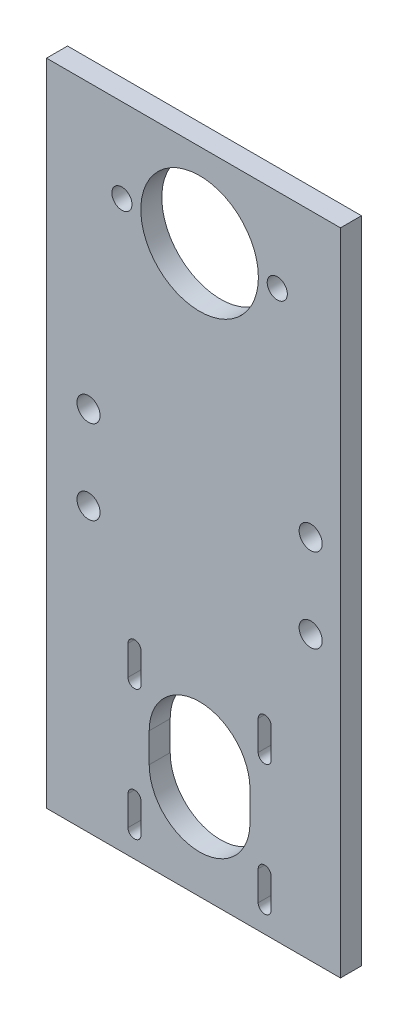
ISO-10303-21;
HEADER;
FILE_DESCRIPTION(('STEP AP214'),'2;1');
FILE_NAME('part.step','',(''),(''),'','','');
FILE_SCHEMA(('AUTOMOTIVE_DESIGN { 1 0 10303 214 1 1 1 1 }'));
ENDSEC;
DATA;
#1=APPLICATION_CONTEXT('core data for automotive mechanical design processes');
#2=APPLICATION_PROTOCOL_DEFINITION('international standard','automotive_design',2000,#1);
#3=PRODUCT_CONTEXT('',#1,'mechanical');
#4=PRODUCT('Part','Part','',(#3));
#5=PRODUCT_RELATED_PRODUCT_CATEGORY('part','',(#4));
#6=PRODUCT_DEFINITION_FORMATION('','',#4);
#7=PRODUCT_DEFINITION_CONTEXT('part definition',#1,'design');
#8=PRODUCT_DEFINITION('design','',#6,#7);
#9=PRODUCT_DEFINITION_SHAPE('','',#8);
#10=(LENGTH_UNIT() NAMED_UNIT(*) SI_UNIT(.MILLI.,.METRE.));
#11=(NAMED_UNIT(*) PLANE_ANGLE_UNIT() SI_UNIT($,.RADIAN.));
#12=(NAMED_UNIT(*) SI_UNIT($,.STERADIAN.) SOLID_ANGLE_UNIT());
#13=UNCERTAINTY_MEASURE_WITH_UNIT(LENGTH_MEASURE(1.E-05),#10,'distance_accuracy_value','');
#14=(GEOMETRIC_REPRESENTATION_CONTEXT(3) GLOBAL_UNCERTAINTY_ASSIGNED_CONTEXT((#13)) GLOBAL_UNIT_ASSIGNED_CONTEXT((#10,
#11,#12)) REPRESENTATION_CONTEXT('',''));
#15=CARTESIAN_POINT('',(0.,0.,0.));
#16=DIRECTION('',(0.,0.,1.));
#17=DIRECTION('',(1.,0.,0.));
#18=AXIS2_PLACEMENT_3D('',#15,#16,#17);
#19=CARTESIAN_POINT('',(-36.4504721681116,0.,5.));
#20=DIRECTION('',(-1.,0.,0.));
#21=DIRECTION('',(0.,0.,1.));
#22=AXIS2_PLACEMENT_3D('',#19,#20,#21);
#23=PLANE('',#22);
#24=DIRECTION('',(0.,1.,0.));
#25=VECTOR('',#24,1.);
#26=CARTESIAN_POINT('',(-36.4504721681116,0.,0.));
#27=LINE('',#26,#25);
#28=CARTESIAN_POINT('',(-36.4504721681116,-77.3565721257236,0.));
#29=VERTEX_POINT('',#28);
#30=CARTESIAN_POINT('',(-36.4504721681116,77.3565721257236,0.));
#31=VERTEX_POINT('',#30);
#32=EDGE_CURVE('E364',#29,#31,#27,.T.);
#33=ORIENTED_EDGE('',*,*,#32,.F.);
#34=DIRECTION('',(0.,0.,-1.));
#35=VECTOR('',#34,1.);
#36=CARTESIAN_POINT('',(-36.4504721681116,-77.3565721257236,5.));
#37=LINE('',#36,#35);
#38=CARTESIAN_POINT('',(-36.4504721681116,-77.3565721257236,5.));
#39=VERTEX_POINT('',#38);
#40=EDGE_CURVE('E11',#39,#29,#37,.T.);
#41=ORIENTED_EDGE('',*,*,#40,.F.);
#42=DIRECTION('',(0.,1.,0.));
#43=VECTOR('',#42,1.);
#44=CARTESIAN_POINT('',(-36.4504721681116,0.,5.));
#45=LINE('',#44,#43);
#46=CARTESIAN_POINT('',(-36.4504721681116,77.3565721257236,5.));
#47=VERTEX_POINT('',#46);
#48=EDGE_CURVE('E221',#39,#47,#45,.T.);
#49=ORIENTED_EDGE('',*,*,#48,.T.);
#50=DIRECTION('',(0.,0.,-1.));
#51=VECTOR('',#50,1.);
#52=CARTESIAN_POINT('',(-36.4504721681116,77.3565721257236,5.));
#53=LINE('',#52,#51);
#54=EDGE_CURVE('E59',#47,#31,#53,.T.);
#55=ORIENTED_EDGE('',*,*,#54,.T.);
#56=EDGE_LOOP('',(#33,#41,#49,#55));
#57=FACE_BOUND('',#56,.T.);
#58=ADVANCED_FACE('F40',(#57),#23,.T.);
#59=CARTESIAN_POINT('',(0.,-77.3565721257236,5.));
#60=DIRECTION('',(0.,1.,0.));
#61=DIRECTION('',(0.,0.,1.));
#62=AXIS2_PLACEMENT_3D('',#59,#60,#61);
#63=PLANE('',#62);
#64=DIRECTION('',(1.,0.,0.));
#65=VECTOR('',#64,1.);
#66=CARTESIAN_POINT('',(0.,-77.3565721257236,0.));
#67=LINE('',#66,#65);
#68=CARTESIAN_POINT('',(33.5495278318884,-77.3565721257236,0.));
#69=VERTEX_POINT('',#68);
#70=EDGE_CURVE('E226',#29,#69,#67,.T.);
#71=ORIENTED_EDGE('',*,*,#70,.T.);
#72=DIRECTION('',(0.,0.,-1.));
#73=VECTOR('',#72,1.);
#74=CARTESIAN_POINT('',(33.5495278318884,-77.3565721257236,5.));
#75=LINE('',#74,#73);
#76=CARTESIAN_POINT('',(33.5495278318884,-77.3565721257236,5.));
#77=VERTEX_POINT('',#76);
#78=EDGE_CURVE('E50',#77,#69,#75,.T.);
#79=ORIENTED_EDGE('',*,*,#78,.F.);
#80=DIRECTION('',(1.,0.,0.));
#81=VECTOR('',#80,1.);
#82=CARTESIAN_POINT('',(0.,-77.3565721257236,5.));
#83=LINE('',#82,#81);
#84=EDGE_CURVE('E216',#39,#77,#83,.T.);
#85=ORIENTED_EDGE('',*,*,#84,.F.);
#86=ORIENTED_EDGE('',*,*,#40,.T.);
#87=EDGE_LOOP('',(#71,#79,#85,#86));
#88=FACE_BOUND('',#87,.T.);
#89=ADVANCED_FACE('F224',(#88),#63,.F.);
#90=CARTESIAN_POINT('',(33.5495278318884,0.,5.));
#91=DIRECTION('',(-1.,0.,0.));
#92=DIRECTION('',(0.,0.,1.));
#93=AXIS2_PLACEMENT_3D('',#90,#91,#92);
#94=PLANE('',#93);
#95=DIRECTION('',(0.,1.,0.));
#96=VECTOR('',#95,1.);
#97=CARTESIAN_POINT('',(33.5495278318884,0.,0.));
#98=LINE('',#97,#96);
#99=CARTESIAN_POINT('',(33.5495278318884,77.3565721257236,0.));
#100=VERTEX_POINT('',#99);
#101=EDGE_CURVE('E367',#69,#100,#98,.T.);
#102=ORIENTED_EDGE('',*,*,#101,.T.);
#103=DIRECTION('',(0.,0.,-1.));
#104=VECTOR('',#103,1.);
#105=CARTESIAN_POINT('',(33.5495278318884,77.3565721257236,5.));
#106=LINE('',#105,#104);
#107=CARTESIAN_POINT('',(33.5495278318884,77.3565721257236,5.));
#108=VERTEX_POINT('',#107);
#109=EDGE_CURVE('E133',#108,#100,#106,.T.);
#110=ORIENTED_EDGE('',*,*,#109,.F.);
#111=DIRECTION('',(0.,1.,0.));
#112=VECTOR('',#111,1.);
#113=CARTESIAN_POINT('',(33.5495278318884,0.,5.));
#114=LINE('',#113,#112);
#115=EDGE_CURVE('E208',#77,#108,#114,.T.);
#116=ORIENTED_EDGE('',*,*,#115,.F.);
#117=ORIENTED_EDGE('',*,*,#78,.T.);
#118=EDGE_LOOP('',(#102,#110,#116,#117));
#119=FACE_BOUND('',#118,.T.);
#120=ADVANCED_FACE('F210',(#119),#94,.F.);
#121=CARTESIAN_POINT('',(-15.5,-40.6434278742764,5.));
#122=DIRECTION('',(0.,0.,-1.));
#123=DIRECTION('',(-1.,0.,0.));
#124=AXIS2_PLACEMENT_3D('',#121,#122,#123);
#125=CYLINDRICAL_SURFACE('',#124,1.55);
#126=CARTESIAN_POINT('',(-15.5,-40.6434278742764,0.));
#127=DIRECTION('',(0.,0.,1.));
#128=DIRECTION('',(1.,0.,0.));
#129=AXIS2_PLACEMENT_3D('',#126,#127,#128);
#130=CIRCLE('',#129,1.55);
#131=CARTESIAN_POINT('',(-17.05,-40.6434278742764,0.));
#132=VERTEX_POINT('',#131);
#133=CARTESIAN_POINT('',(-13.95,-40.6434278742764,0.));
#134=VERTEX_POINT('',#133);
#135=EDGE_CURVE('E331',#132,#134,#130,.T.);
#136=ORIENTED_EDGE('',*,*,#135,.F.);
#137=DIRECTION('',(0.,0.,-1.));
#138=VECTOR('',#137,1.);
#139=CARTESIAN_POINT('',(-17.05,-40.6434278742764,5.));
#140=LINE('',#139,#138);
#141=CARTESIAN_POINT('',(-17.05,-40.6434278742764,5.));
#142=VERTEX_POINT('',#141);
#143=EDGE_CURVE('E238',#142,#132,#140,.T.);
#144=ORIENTED_EDGE('',*,*,#143,.F.);
#145=CARTESIAN_POINT('',(-15.5,-40.6434278742764,5.));
#146=DIRECTION('',(0.,0.,1.));
#147=DIRECTION('',(1.,0.,0.));
#148=AXIS2_PLACEMENT_3D('',#145,#146,#147);
#149=CIRCLE('',#148,1.55);
#150=CARTESIAN_POINT('',(-13.95,-40.6434278742764,5.));
#151=VERTEX_POINT('',#150);
#152=EDGE_CURVE('E413',#142,#151,#149,.T.);
#153=ORIENTED_EDGE('',*,*,#152,.T.);
#154=DIRECTION('',(0.,0.,-1.));
#155=VECTOR('',#154,1.);
#156=CARTESIAN_POINT('',(-13.95,-40.6434278742764,5.));
#157=LINE('',#156,#155);
#158=EDGE_CURVE('E231',#151,#134,#157,.T.);
#159=ORIENTED_EDGE('',*,*,#158,.T.);
#160=EDGE_LOOP('',(#136,#144,#153,#159));
#161=FACE_BOUND('',#160,.T.);
#162=ADVANCED_FACE('F509',(#161),#125,.F.);
#163=CARTESIAN_POINT('',(-17.05,0.,5.));
#164=DIRECTION('',(1.,0.,0.));
#165=DIRECTION('',(0.,1.,0.));
#166=AXIS2_PLACEMENT_3D('',#163,#164,#165);
#167=PLANE('',#166);
#168=DIRECTION('',(0.,-1.,0.));
#169=VECTOR('',#168,1.);
#170=CARTESIAN_POINT('',(-17.05,0.,0.));
#171=LINE('',#170,#169);
#172=CARTESIAN_POINT('',(-17.05,-33.6434278742764,0.));
#173=VERTEX_POINT('',#172);
#174=EDGE_CURVE('E334',#173,#132,#171,.T.);
#175=ORIENTED_EDGE('',*,*,#174,.F.);
#176=DIRECTION('',(0.,0.,-1.));
#177=VECTOR('',#176,1.);
#178=CARTESIAN_POINT('',(-17.05,-33.6434278742764,5.));
#179=LINE('',#178,#177);
#180=CARTESIAN_POINT('',(-17.05,-33.6434278742764,5.));
#181=VERTEX_POINT('',#180);
#182=EDGE_CURVE('E236',#181,#173,#179,.T.);
#183=ORIENTED_EDGE('',*,*,#182,.F.);
#184=DIRECTION('',(0.,-1.,0.));
#185=VECTOR('',#184,1.);
#186=CARTESIAN_POINT('',(-17.05,0.,5.));
#187=LINE('',#186,#185);
#188=EDGE_CURVE('E416',#181,#142,#187,.T.);
#189=ORIENTED_EDGE('',*,*,#188,.T.);
#190=ORIENTED_EDGE('',*,*,#143,.T.);
#191=EDGE_LOOP('',(#175,#183,#189,#190));
#192=FACE_BOUND('',#191,.T.);
#193=ADVANCED_FACE('F505',(#192),#167,.T.);
#194=CARTESIAN_POINT('',(-15.5,-33.6434278742764,5.));
#195=DIRECTION('',(0.,0.,-1.));
#196=DIRECTION('',(-1.,0.,0.));
#197=AXIS2_PLACEMENT_3D('',#194,#195,#196);
#198=CYLINDRICAL_SURFACE('',#197,1.55);
#199=CARTESIAN_POINT('',(-15.5,-33.6434278742764,0.));
#200=DIRECTION('',(0.,0.,1.));
#201=DIRECTION('',(1.,0.,0.));
#202=AXIS2_PLACEMENT_3D('',#199,#200,#201);
#203=CIRCLE('',#202,1.55);
#204=CARTESIAN_POINT('',(-13.95,-33.6434278742764,0.));
#205=VERTEX_POINT('',#204);
#206=EDGE_CURVE('E337',#205,#173,#203,.T.);
#207=ORIENTED_EDGE('',*,*,#206,.F.);
#208=DIRECTION('',(0.,0.,-1.));
#209=VECTOR('',#208,1.);
#210=CARTESIAN_POINT('',(-13.95,-33.6434278742764,5.));
#211=LINE('',#210,#209);
#212=CARTESIAN_POINT('',(-13.95,-33.6434278742764,5.));
#213=VERTEX_POINT('',#212);
#214=EDGE_CURVE('E233',#213,#205,#211,.T.);
#215=ORIENTED_EDGE('',*,*,#214,.F.);
#216=CARTESIAN_POINT('',(-15.5,-33.6434278742764,5.));
#217=DIRECTION('',(0.,0.,1.));
#218=DIRECTION('',(1.,0.,0.));
#219=AXIS2_PLACEMENT_3D('',#216,#217,#218);
#220=CIRCLE('',#219,1.55);
#221=EDGE_CURVE('E419',#213,#181,#220,.T.);
#222=ORIENTED_EDGE('',*,*,#221,.T.);
#223=ORIENTED_EDGE('',*,*,#182,.T.);
#224=EDGE_LOOP('',(#207,#215,#222,#223));
#225=FACE_BOUND('',#224,.T.);
#226=ADVANCED_FACE('F501',(#225),#198,.F.);
#227=CARTESIAN_POINT('',(15.5,-40.6434278742764,5.));
#228=DIRECTION('',(0.,0.,-1.));
#229=DIRECTION('',(-1.,0.,0.));
#230=AXIS2_PLACEMENT_3D('',#227,#228,#229);
#231=CYLINDRICAL_SURFACE('',#230,1.55);
#232=CARTESIAN_POINT('',(15.5,-40.6434278742764,0.));
#233=DIRECTION('',(0.,0.,1.));
#234=DIRECTION('',(1.,0.,0.));
#235=AXIS2_PLACEMENT_3D('',#232,#233,#234);
#236=CIRCLE('',#235,1.55);
#237=CARTESIAN_POINT('',(13.95,-40.6434278742764,0.));
#238=VERTEX_POINT('',#237);
#239=CARTESIAN_POINT('',(17.05,-40.6434278742764,0.));
#240=VERTEX_POINT('',#239);
#241=EDGE_CURVE('E319',#238,#240,#236,.T.);
#242=ORIENTED_EDGE('',*,*,#241,.F.);
#243=DIRECTION('',(0.,0.,-1.));
#244=VECTOR('',#243,1.);
#245=CARTESIAN_POINT('',(13.95,-40.6434278742764,5.));
#246=LINE('',#245,#244);
#247=CARTESIAN_POINT('',(13.95,-40.6434278742764,5.));
#248=VERTEX_POINT('',#247);
#249=EDGE_CURVE('E234',#248,#238,#246,.T.);
#250=ORIENTED_EDGE('',*,*,#249,.F.);
#251=CARTESIAN_POINT('',(15.5,-40.6434278742764,5.));
#252=DIRECTION('',(0.,0.,1.));
#253=DIRECTION('',(1.,0.,0.));
#254=AXIS2_PLACEMENT_3D('',#251,#252,#253);
#255=CIRCLE('',#254,1.55);
#256=CARTESIAN_POINT('',(17.05,-40.6434278742764,5.));
#257=VERTEX_POINT('',#256);
#258=EDGE_CURVE('E402',#248,#257,#255,.T.);
#259=ORIENTED_EDGE('',*,*,#258,.T.);
#260=DIRECTION('',(0.,0.,-1.));
#261=VECTOR('',#260,1.);
#262=CARTESIAN_POINT('',(17.05,-40.6434278742764,5.));
#263=LINE('',#262,#261);
#264=EDGE_CURVE('E240',#257,#240,#263,.T.);
#265=ORIENTED_EDGE('',*,*,#264,.T.);
#266=EDGE_LOOP('',(#242,#250,#259,#265));
#267=FACE_BOUND('',#266,.T.);
#268=ADVANCED_FACE('F504',(#267),#231,.F.);
#269=CARTESIAN_POINT('',(13.95,0.,5.));
#270=DIRECTION('',(1.,0.,0.));
#271=DIRECTION('',(0.,0.,-1.));
#272=AXIS2_PLACEMENT_3D('',#269,#270,#271);
#273=PLANE('',#272);
#274=DIRECTION('',(0.,-1.,0.));
#275=VECTOR('',#274,1.);
#276=CARTESIAN_POINT('',(13.95,0.,0.));
#277=LINE('',#276,#275);
#278=CARTESIAN_POINT('',(13.95,-33.6434278742764,0.));
#279=VERTEX_POINT('',#278);
#280=EDGE_CURVE('E322',#279,#238,#277,.T.);
#281=ORIENTED_EDGE('',*,*,#280,.F.);
#282=DIRECTION('',(0.,0.,-1.));
#283=VECTOR('',#282,1.);
#284=CARTESIAN_POINT('',(13.95,-33.6434278742764,5.));
#285=LINE('',#284,#283);
#286=CARTESIAN_POINT('',(13.95,-33.6434278742764,5.));
#287=VERTEX_POINT('',#286);
#288=EDGE_CURVE('E245',#287,#279,#285,.T.);
#289=ORIENTED_EDGE('',*,*,#288,.F.);
#290=DIRECTION('',(0.,-1.,0.));
#291=VECTOR('',#290,1.);
#292=CARTESIAN_POINT('',(13.95,0.,5.));
#293=LINE('',#292,#291);
#294=EDGE_CURVE('E405',#287,#248,#293,.T.);
#295=ORIENTED_EDGE('',*,*,#294,.T.);
#296=ORIENTED_EDGE('',*,*,#249,.T.);
#297=EDGE_LOOP('',(#281,#289,#295,#296));
#298=FACE_BOUND('',#297,.T.);
#299=ADVANCED_FACE('F522',(#298),#273,.T.);
#300=CARTESIAN_POINT('',(15.5,-33.6434278742764,5.));
#301=DIRECTION('',(0.,0.,-1.));
#302=DIRECTION('',(-1.,0.,0.));
#303=AXIS2_PLACEMENT_3D('',#300,#301,#302);
#304=CYLINDRICAL_SURFACE('',#303,1.55);
#305=CARTESIAN_POINT('',(15.5,-33.6434278742764,0.));
#306=DIRECTION('',(0.,0.,1.));
#307=DIRECTION('',(1.,0.,0.));
#308=AXIS2_PLACEMENT_3D('',#305,#306,#307);
#309=CIRCLE('',#308,1.55);
#310=CARTESIAN_POINT('',(17.05,-33.6434278742764,0.));
#311=VERTEX_POINT('',#310);
#312=EDGE_CURVE('E325',#311,#279,#309,.T.);
#313=ORIENTED_EDGE('',*,*,#312,.F.);
#314=DIRECTION('',(0.,0.,-1.));
#315=VECTOR('',#314,1.);
#316=CARTESIAN_POINT('',(17.05,-33.6434278742764,5.));
#317=LINE('',#316,#315);
#318=CARTESIAN_POINT('',(17.05,-33.6434278742764,5.));
#319=VERTEX_POINT('',#318);
#320=EDGE_CURVE('E242',#319,#311,#317,.T.);
#321=ORIENTED_EDGE('',*,*,#320,.F.);
#322=CARTESIAN_POINT('',(15.5,-33.6434278742764,5.));
#323=DIRECTION('',(0.,0.,1.));
#324=DIRECTION('',(1.,0.,0.));
#325=AXIS2_PLACEMENT_3D('',#322,#323,#324);
#326=CIRCLE('',#325,1.55);
#327=EDGE_CURVE('E408',#319,#287,#326,.T.);
#328=ORIENTED_EDGE('',*,*,#327,.T.);
#329=ORIENTED_EDGE('',*,*,#288,.T.);
#330=EDGE_LOOP('',(#313,#321,#328,#329));
#331=FACE_BOUND('',#330,.T.);
#332=ADVANCED_FACE('F518',(#331),#304,.F.);
#333=CARTESIAN_POINT('',(15.5,-71.6434278742764,5.));
#334=DIRECTION('',(0.,0.,-1.));
#335=DIRECTION('',(-1.,0.,0.));
#336=AXIS2_PLACEMENT_3D('',#333,#334,#335);
#337=CYLINDRICAL_SURFACE('',#336,1.55);
#338=CARTESIAN_POINT('',(15.5,-71.6434278742764,0.));
#339=DIRECTION('',(0.,0.,1.));
#340=DIRECTION('',(1.,0.,0.));
#341=AXIS2_PLACEMENT_3D('',#338,#339,#340);
#342=CIRCLE('',#341,1.55);
#343=CARTESIAN_POINT('',(13.95,-71.6434278742764,0.));
#344=VERTEX_POINT('',#343);
#345=CARTESIAN_POINT('',(17.05,-71.6434278742764,0.));
#346=VERTEX_POINT('',#345);
#347=EDGE_CURVE('E307',#344,#346,#342,.T.);
#348=ORIENTED_EDGE('',*,*,#347,.F.);
#349=DIRECTION('',(0.,0.,-1.));
#350=VECTOR('',#349,1.);
#351=CARTESIAN_POINT('',(13.95,-71.6434278742764,5.));
#352=LINE('',#351,#350);
#353=CARTESIAN_POINT('',(13.95,-71.6434278742764,5.));
#354=VERTEX_POINT('',#353);
#355=EDGE_CURVE('E243',#354,#344,#352,.T.);
#356=ORIENTED_EDGE('',*,*,#355,.F.);
#357=CARTESIAN_POINT('',(15.5,-71.6434278742764,5.));
#358=DIRECTION('',(0.,0.,1.));
#359=DIRECTION('',(1.,0.,0.));
#360=AXIS2_PLACEMENT_3D('',#357,#358,#359);
#361=CIRCLE('',#360,1.55);
#362=CARTESIAN_POINT('',(17.05,-71.6434278742764,5.));
#363=VERTEX_POINT('',#362);
#364=EDGE_CURVE('E391',#354,#363,#361,.T.);
#365=ORIENTED_EDGE('',*,*,#364,.T.);
#366=DIRECTION('',(0.,0.,-1.));
#367=VECTOR('',#366,1.);
#368=CARTESIAN_POINT('',(17.05,-71.6434278742764,5.));
#369=LINE('',#368,#367);
#370=EDGE_CURVE('E248',#363,#346,#369,.T.);
#371=ORIENTED_EDGE('',*,*,#370,.T.);
#372=EDGE_LOOP('',(#348,#356,#365,#371));
#373=FACE_BOUND('',#372,.T.);
#374=ADVANCED_FACE('F521',(#373),#337,.F.);
#375=CARTESIAN_POINT('',(13.95,0.,5.));
#376=DIRECTION('',(1.,0.,0.));
#377=DIRECTION('',(0.,0.,-1.));
#378=AXIS2_PLACEMENT_3D('',#375,#376,#377);
#379=PLANE('',#378);
#380=DIRECTION('',(0.,-1.,0.));
#381=VECTOR('',#380,1.);
#382=CARTESIAN_POINT('',(13.95,0.,0.));
#383=LINE('',#382,#381);
#384=CARTESIAN_POINT('',(13.95,-64.6434278742764,0.));
#385=VERTEX_POINT('',#384);
#386=EDGE_CURVE('E310',#385,#344,#383,.T.);
#387=ORIENTED_EDGE('',*,*,#386,.F.);
#388=DIRECTION('',(0.,0.,-1.));
#389=VECTOR('',#388,1.);
#390=CARTESIAN_POINT('',(13.95,-64.6434278742764,5.));
#391=LINE('',#390,#389);
#392=CARTESIAN_POINT('',(13.95,-64.6434278742764,5.));
#393=VERTEX_POINT('',#392);
#394=EDGE_CURVE('E253',#393,#385,#391,.T.);
#395=ORIENTED_EDGE('',*,*,#394,.F.);
#396=DIRECTION('',(0.,-1.,0.));
#397=VECTOR('',#396,1.);
#398=CARTESIAN_POINT('',(13.95,0.,5.));
#399=LINE('',#398,#397);
#400=EDGE_CURVE('E394',#393,#354,#399,.T.);
#401=ORIENTED_EDGE('',*,*,#400,.T.);
#402=ORIENTED_EDGE('',*,*,#355,.T.);
#403=EDGE_LOOP('',(#387,#395,#401,#402));
#404=FACE_BOUND('',#403,.T.);
#405=ADVANCED_FACE('F537',(#404),#379,.T.);
#406=CARTESIAN_POINT('',(15.5,-64.6434278742764,5.));
#407=DIRECTION('',(0.,0.,-1.));
#408=DIRECTION('',(-1.,0.,0.));
#409=AXIS2_PLACEMENT_3D('',#406,#407,#408);
#410=CYLINDRICAL_SURFACE('',#409,1.55);
#411=CARTESIAN_POINT('',(15.5,-64.6434278742764,0.));
#412=DIRECTION('',(0.,0.,1.));
#413=DIRECTION('',(1.,0.,0.));
#414=AXIS2_PLACEMENT_3D('',#411,#412,#413);
#415=CIRCLE('',#414,1.55);
#416=CARTESIAN_POINT('',(17.05,-64.6434278742764,0.));
#417=VERTEX_POINT('',#416);
#418=EDGE_CURVE('E313',#417,#385,#415,.T.);
#419=ORIENTED_EDGE('',*,*,#418,.F.);
#420=DIRECTION('',(0.,0.,-1.));
#421=VECTOR('',#420,1.);
#422=CARTESIAN_POINT('',(17.05,-64.6434278742764,5.));
#423=LINE('',#422,#421);
#424=CARTESIAN_POINT('',(17.05,-64.6434278742764,5.));
#425=VERTEX_POINT('',#424);
#426=EDGE_CURVE('E250',#425,#417,#423,.T.);
#427=ORIENTED_EDGE('',*,*,#426,.F.);
#428=CARTESIAN_POINT('',(15.5,-64.6434278742764,5.));
#429=DIRECTION('',(0.,0.,1.));
#430=DIRECTION('',(1.,0.,0.));
#431=AXIS2_PLACEMENT_3D('',#428,#429,#430);
#432=CIRCLE('',#431,1.55);
#433=EDGE_CURVE('E397',#425,#393,#432,.T.);
#434=ORIENTED_EDGE('',*,*,#433,.T.);
#435=ORIENTED_EDGE('',*,*,#394,.T.);
#436=EDGE_LOOP('',(#419,#427,#434,#435));
#437=FACE_BOUND('',#436,.T.);
#438=ADVANCED_FACE('F533',(#437),#410,.F.);
#439=CARTESIAN_POINT('',(-15.5,-71.6434278742764,5.));
#440=DIRECTION('',(0.,0.,-1.));
#441=DIRECTION('',(-1.,0.,0.));
#442=AXIS2_PLACEMENT_3D('',#439,#440,#441);
#443=CYLINDRICAL_SURFACE('',#442,1.55);
#444=CARTESIAN_POINT('',(-15.5,-71.6434278742764,0.));
#445=DIRECTION('',(0.,0.,1.));
#446=DIRECTION('',(1.,0.,0.));
#447=AXIS2_PLACEMENT_3D('',#444,#445,#446);
#448=CIRCLE('',#447,1.55);
#449=CARTESIAN_POINT('',(-17.05,-71.6434278742764,0.));
#450=VERTEX_POINT('',#449);
#451=CARTESIAN_POINT('',(-13.95,-71.6434278742764,0.));
#452=VERTEX_POINT('',#451);
#453=EDGE_CURVE('E295',#450,#452,#448,.T.);
#454=ORIENTED_EDGE('',*,*,#453,.F.);
#455=DIRECTION('',(0.,0.,-1.));
#456=VECTOR('',#455,1.);
#457=CARTESIAN_POINT('',(-17.05,-71.6434278742764,5.));
#458=LINE('',#457,#456);
#459=CARTESIAN_POINT('',(-17.05,-71.6434278742764,5.));
#460=VERTEX_POINT('',#459);
#461=EDGE_CURVE('E251',#460,#450,#458,.T.);
#462=ORIENTED_EDGE('',*,*,#461,.F.);
#463=CARTESIAN_POINT('',(-15.5,-71.6434278742764,5.));
#464=DIRECTION('',(0.,0.,1.));
#465=DIRECTION('',(1.,0.,0.));
#466=AXIS2_PLACEMENT_3D('',#463,#464,#465);
#467=CIRCLE('',#466,1.55);
#468=CARTESIAN_POINT('',(-13.95,-71.6434278742764,5.));
#469=VERTEX_POINT('',#468);
#470=EDGE_CURVE('E380',#460,#469,#467,.T.);
#471=ORIENTED_EDGE('',*,*,#470,.T.);
#472=DIRECTION('',(0.,0.,-1.));
#473=VECTOR('',#472,1.);
#474=CARTESIAN_POINT('',(-13.95,-71.6434278742764,5.));
#475=LINE('',#474,#473);
#476=EDGE_CURVE('E256',#469,#452,#475,.T.);
#477=ORIENTED_EDGE('',*,*,#476,.T.);
#478=EDGE_LOOP('',(#454,#462,#471,#477));
#479=FACE_BOUND('',#478,.T.);
#480=ADVANCED_FACE('F536',(#479),#443,.F.);
#481=CARTESIAN_POINT('',(-17.05,0.,5.));
#482=DIRECTION('',(1.,0.,0.));
#483=DIRECTION('',(0.,0.,-1.));
#484=AXIS2_PLACEMENT_3D('',#481,#482,#483);
#485=PLANE('',#484);
#486=DIRECTION('',(0.,-1.,0.));
#487=VECTOR('',#486,1.);
#488=CARTESIAN_POINT('',(-17.05,0.,0.));
#489=LINE('',#488,#487);
#490=CARTESIAN_POINT('',(-17.05,-64.6434278742764,0.));
#491=VERTEX_POINT('',#490);
#492=EDGE_CURVE('E298',#491,#450,#489,.T.);
#493=ORIENTED_EDGE('',*,*,#492,.F.);
#494=DIRECTION('',(0.,0.,-1.));
#495=VECTOR('',#494,1.);
#496=CARTESIAN_POINT('',(-17.05,-64.6434278742764,5.));
#497=LINE('',#496,#495);
#498=CARTESIAN_POINT('',(-17.05,-64.6434278742764,5.));
#499=VERTEX_POINT('',#498);
#500=EDGE_CURVE('E260',#499,#491,#497,.T.);
#501=ORIENTED_EDGE('',*,*,#500,.F.);
#502=DIRECTION('',(0.,-1.,0.));
#503=VECTOR('',#502,1.);
#504=CARTESIAN_POINT('',(-17.05,0.,5.));
#505=LINE('',#504,#503);
#506=EDGE_CURVE('E383',#499,#460,#505,.T.);
#507=ORIENTED_EDGE('',*,*,#506,.T.);
#508=ORIENTED_EDGE('',*,*,#461,.T.);
#509=EDGE_LOOP('',(#493,#501,#507,#508));
#510=FACE_BOUND('',#509,.T.);
#511=ADVANCED_FACE('F551',(#510),#485,.T.);
#512=CARTESIAN_POINT('',(-15.5,-64.6434278742764,5.));
#513=DIRECTION('',(0.,0.,-1.));
#514=DIRECTION('',(-1.,0.,0.));
#515=AXIS2_PLACEMENT_3D('',#512,#513,#514);
#516=CYLINDRICAL_SURFACE('',#515,1.55);
#517=CARTESIAN_POINT('',(-15.5,-64.6434278742764,0.));
#518=DIRECTION('',(0.,0.,1.));
#519=DIRECTION('',(1.,0.,0.));
#520=AXIS2_PLACEMENT_3D('',#517,#518,#519);
#521=CIRCLE('',#520,1.55);
#522=CARTESIAN_POINT('',(-13.95,-64.6434278742764,0.));
#523=VERTEX_POINT('',#522);
#524=EDGE_CURVE('E301',#523,#491,#521,.T.);
#525=ORIENTED_EDGE('',*,*,#524,.F.);
#526=DIRECTION('',(0.,0.,-1.));
#527=VECTOR('',#526,1.);
#528=CARTESIAN_POINT('',(-13.95,-64.6434278742764,5.));
#529=LINE('',#528,#527);
#530=CARTESIAN_POINT('',(-13.95,-64.6434278742764,5.));
#531=VERTEX_POINT('',#530);
#532=EDGE_CURVE('E258',#531,#523,#529,.T.);
#533=ORIENTED_EDGE('',*,*,#532,.F.);
#534=CARTESIAN_POINT('',(-15.5,-64.6434278742764,5.));
#535=DIRECTION('',(0.,0.,1.));
#536=DIRECTION('',(1.,0.,0.));
#537=AXIS2_PLACEMENT_3D('',#534,#535,#536);
#538=CIRCLE('',#537,1.55);
#539=EDGE_CURVE('E386',#531,#499,#538,.T.);
#540=ORIENTED_EDGE('',*,*,#539,.T.);
#541=ORIENTED_EDGE('',*,*,#500,.T.);
#542=EDGE_LOOP('',(#525,#533,#540,#541));
#543=FACE_BOUND('',#542,.T.);
#544=ADVANCED_FACE('F548',(#543),#516,.F.);
#545=CARTESIAN_POINT('',(0.,-49.1434278742764,5.));
#546=DIRECTION('',(0.,0.,-1.));
#547=DIRECTION('',(-1.,0.,0.));
#548=AXIS2_PLACEMENT_3D('',#545,#546,#547);
#549=CYLINDRICAL_SURFACE('',#548,12.);
#550=CARTESIAN_POINT('',(0.,-49.1434278742764,0.));
#551=DIRECTION('',(0.,0.,1.));
#552=DIRECTION('',(1.,0.,0.));
#553=AXIS2_PLACEMENT_3D('',#550,#551,#552);
#554=CIRCLE('',#553,12.);
#555=CARTESIAN_POINT('',(12.,-49.1434278742764,0.));
#556=VERTEX_POINT('',#555);
#557=CARTESIAN_POINT('',(-12.,-49.1434278742764,0.));
#558=VERTEX_POINT('',#557);
#559=EDGE_CURVE('E280',#556,#558,#554,.T.);
#560=ORIENTED_EDGE('',*,*,#559,.F.);
#561=DIRECTION('',(0.,0.,-1.));
#562=VECTOR('',#561,1.);
#563=CARTESIAN_POINT('',(12.,-49.1434278742764,5.));
#564=LINE('',#563,#562);
#565=CARTESIAN_POINT('',(12.,-49.1434278742764,5.));
#566=VERTEX_POINT('',#565);
#567=EDGE_CURVE('E44',#566,#556,#564,.T.);
#568=ORIENTED_EDGE('',*,*,#567,.F.);
#569=CARTESIAN_POINT('',(0.,-49.1434278742764,5.));
#570=DIRECTION('',(0.,0.,1.));
#571=DIRECTION('',(1.,0.,0.));
#572=AXIS2_PLACEMENT_3D('',#569,#570,#571);
#573=CIRCLE('',#572,12.);
#574=CARTESIAN_POINT('',(-12.,-49.1434278742764,5.));
#575=VERTEX_POINT('',#574);
#576=EDGE_CURVE('E371',#566,#575,#573,.T.);
#577=ORIENTED_EDGE('',*,*,#576,.T.);
#578=DIRECTION('',(0.,0.,-1.));
#579=VECTOR('',#578,1.);
#580=CARTESIAN_POINT('',(-12.,-49.1434278742764,5.));
#581=LINE('',#580,#579);
#582=EDGE_CURVE('E263',#575,#558,#581,.T.);
#583=ORIENTED_EDGE('',*,*,#582,.T.);
#584=EDGE_LOOP('',(#560,#568,#577,#583));
#585=FACE_BOUND('',#584,.T.);
#586=ADVANCED_FACE('F42',(#585),#549,.F.);
#587=CARTESIAN_POINT('',(12.,0.,5.));
#588=DIRECTION('',(-1.,0.,0.));
#589=DIRECTION('',(0.,-1.,0.));
#590=AXIS2_PLACEMENT_3D('',#587,#588,#589);
#591=PLANE('',#590);
#592=DIRECTION('',(0.,1.,0.));
#593=VECTOR('',#592,1.);
#594=CARTESIAN_POINT('',(12.,0.,0.));
#595=LINE('',#594,#593);
#596=CARTESIAN_POINT('',(12.,-56.1434278742764,0.));
#597=VERTEX_POINT('',#596);
#598=EDGE_CURVE('E275',#597,#556,#595,.T.);
#599=ORIENTED_EDGE('',*,*,#598,.F.);
#600=DIRECTION('',(0.,0.,-1.));
#601=VECTOR('',#600,1.);
#602=CARTESIAN_POINT('',(12.,-56.1434278742764,5.));
#603=LINE('',#602,#601);
#604=CARTESIAN_POINT('',(12.,-56.1434278742764,5.));
#605=VERTEX_POINT('',#604);
#606=EDGE_CURVE('E266',#605,#597,#603,.T.);
#607=ORIENTED_EDGE('',*,*,#606,.F.);
#608=DIRECTION('',(0.,1.,0.));
#609=VECTOR('',#608,1.);
#610=CARTESIAN_POINT('',(12.,0.,5.));
#611=LINE('',#610,#609);
#612=EDGE_CURVE('E278',#605,#566,#611,.T.);
#613=ORIENTED_EDGE('',*,*,#612,.T.);
#614=ORIENTED_EDGE('',*,*,#567,.T.);
#615=EDGE_LOOP('',(#599,#607,#613,#614));
#616=FACE_BOUND('',#615,.T.);
#617=ADVANCED_FACE('F273',(#616),#591,.T.);
#618=CARTESIAN_POINT('',(0.,-56.1434278742764,5.));
#619=DIRECTION('',(0.,0.,-1.));
#620=DIRECTION('',(-1.,0.,0.));
#621=AXIS2_PLACEMENT_3D('',#618,#619,#620);
#622=CYLINDRICAL_SURFACE('',#621,12.);
#623=CARTESIAN_POINT('',(0.,-56.1434278742764,0.));
#624=DIRECTION('',(0.,0.,1.));
#625=DIRECTION('',(1.,0.,0.));
#626=AXIS2_PLACEMENT_3D('',#623,#624,#625);
#627=CIRCLE('',#626,12.);
#628=CARTESIAN_POINT('',(-12.,-56.1434278742764,0.));
#629=VERTEX_POINT('',#628);
#630=EDGE_CURVE('E288',#629,#597,#627,.T.);
#631=ORIENTED_EDGE('',*,*,#630,.F.);
#632=DIRECTION('',(0.,0.,-1.));
#633=VECTOR('',#632,1.);
#634=CARTESIAN_POINT('',(-12.,-56.1434278742764,5.));
#635=LINE('',#634,#633);
#636=CARTESIAN_POINT('',(-12.,-56.1434278742764,5.));
#637=VERTEX_POINT('',#636);
#638=EDGE_CURVE('E265',#637,#629,#635,.T.);
#639=ORIENTED_EDGE('',*,*,#638,.F.);
#640=CARTESIAN_POINT('',(0.,-56.1434278742764,5.));
#641=DIRECTION('',(0.,0.,1.));
#642=DIRECTION('',(1.,0.,0.));
#643=AXIS2_PLACEMENT_3D('',#640,#641,#642);
#644=CIRCLE('',#643,12.);
#645=EDGE_CURVE('E374',#637,#605,#644,.T.);
#646=ORIENTED_EDGE('',*,*,#645,.T.);
#647=ORIENTED_EDGE('',*,*,#606,.T.);
#648=EDGE_LOOP('',(#631,#639,#646,#647));
#649=FACE_BOUND('',#648,.T.);
#650=ADVANCED_FACE('F471',(#649),#622,.F.);
#651=CARTESIAN_POINT('',(-18.5,57.3565721257236,5.));
#652=DIRECTION('',(0.,0.,-1.));
#653=DIRECTION('',(-1.,0.,0.));
#654=AXIS2_PLACEMENT_3D('',#651,#652,#653);
#655=CYLINDRICAL_SURFACE('',#654,2.4);
#656=CARTESIAN_POINT('',(-18.5,57.3565721257236,5.));
#657=DIRECTION('',(0.,0.,1.));
#658=DIRECTION('',(1.,0.,0.));
#659=AXIS2_PLACEMENT_3D('',#656,#657,#658);
#660=CIRCLE('',#659,2.4);
#661=CARTESIAN_POINT('',(-16.1,57.3565721257236,5.));
#662=VERTEX_POINT('',#661);
#663=EDGE_CURVE('E442',#662,#662,#660,.T.);
#664=ORIENTED_EDGE('',*,*,#663,.T.);
#665=EDGE_LOOP('',(#664));
#666=FACE_BOUND('',#665,.T.);
#667=CARTESIAN_POINT('',(-18.5,57.3565721257236,0.));
#668=DIRECTION('',(0.,0.,1.));
#669=DIRECTION('',(1.,0.,0.));
#670=AXIS2_PLACEMENT_3D('',#667,#668,#669);
#671=CIRCLE('',#670,2.4);
#672=CARTESIAN_POINT('',(-16.1,57.3565721257236,0.));
#673=VERTEX_POINT('',#672);
#674=EDGE_CURVE('E361',#673,#673,#671,.T.);
#675=ORIENTED_EDGE('',*,*,#674,.F.);
#676=EDGE_LOOP('',(#675));
#677=FACE_BOUND('',#676,.T.);
#678=ADVANCED_FACE('F467',(#666,#677),#655,.F.);
#679=CARTESIAN_POINT('',(18.5,57.3565721257236,5.));
#680=DIRECTION('',(0.,0.,-1.));
#681=DIRECTION('',(-1.,0.,0.));
#682=AXIS2_PLACEMENT_3D('',#679,#680,#681);
#683=CYLINDRICAL_SURFACE('',#682,2.4);
#684=CARTESIAN_POINT('',(18.5,57.3565721257236,5.));
#685=DIRECTION('',(0.,0.,1.));
#686=DIRECTION('',(1.,0.,0.));
#687=AXIS2_PLACEMENT_3D('',#684,#685,#686);
#688=CIRCLE('',#687,2.4);
#689=CARTESIAN_POINT('',(20.9,57.3565721257236,5.));
#690=VERTEX_POINT('',#689);
#691=EDGE_CURVE('E439',#690,#690,#688,.T.);
#692=ORIENTED_EDGE('',*,*,#691,.T.);
#693=EDGE_LOOP('',(#692));
#694=FACE_BOUND('',#693,.T.);
#695=CARTESIAN_POINT('',(18.5,57.3565721257236,0.));
#696=DIRECTION('',(0.,0.,1.));
#697=DIRECTION('',(1.,0.,0.));
#698=AXIS2_PLACEMENT_3D('',#695,#696,#697);
#699=CIRCLE('',#698,2.4);
#700=CARTESIAN_POINT('',(20.9,57.3565721257236,0.));
#701=VERTEX_POINT('',#700);
#702=EDGE_CURVE('E358',#701,#701,#699,.T.);
#703=ORIENTED_EDGE('',*,*,#702,.F.);
#704=EDGE_LOOP('',(#703));
#705=FACE_BOUND('',#704,.T.);
#706=ADVANCED_FACE('F470',(#694,#705),#683,.F.);
#707=CARTESIAN_POINT('',(-26.4504721681116,10.,5.));
#708=DIRECTION('',(0.,0.,-1.));
#709=DIRECTION('',(-1.,0.,0.));
#710=AXIS2_PLACEMENT_3D('',#707,#708,#709);
#711=CYLINDRICAL_SURFACE('',#710,2.74999999999999);
#712=CARTESIAN_POINT('',(-26.4504721681116,10.,5.));
#713=DIRECTION('',(0.,0.,1.));
#714=DIRECTION('',(1.,0.,0.));
#715=AXIS2_PLACEMENT_3D('',#712,#713,#714);
#716=CIRCLE('',#715,2.74999999999999);
#717=CARTESIAN_POINT('',(-23.7004721681116,10.,5.));
#718=VERTEX_POINT('',#717);
#719=EDGE_CURVE('E436',#718,#718,#716,.T.);
#720=ORIENTED_EDGE('',*,*,#719,.T.);
#721=EDGE_LOOP('',(#720));
#722=FACE_BOUND('',#721,.T.);
#723=CARTESIAN_POINT('',(-26.4504721681116,10.,0.));
#724=DIRECTION('',(0.,0.,1.));
#725=DIRECTION('',(1.,0.,0.));
#726=AXIS2_PLACEMENT_3D('',#723,#724,#725);
#727=CIRCLE('',#726,2.74999999999999);
#728=CARTESIAN_POINT('',(-23.7004721681116,10.,0.));
#729=VERTEX_POINT('',#728);
#730=EDGE_CURVE('E355',#729,#729,#727,.T.);
#731=ORIENTED_EDGE('',*,*,#730,.F.);
#732=EDGE_LOOP('',(#731));
#733=FACE_BOUND('',#732,.T.);
#734=ADVANCED_FACE('F475',(#722,#733),#711,.F.);
#735=CARTESIAN_POINT('',(26.4504721681116,10.,5.));
#736=DIRECTION('',(0.,0.,-1.));
#737=DIRECTION('',(-1.,0.,0.));
#738=AXIS2_PLACEMENT_3D('',#735,#736,#737);
#739=CYLINDRICAL_SURFACE('',#738,2.75);
#740=CARTESIAN_POINT('',(26.4504721681116,10.,5.));
#741=DIRECTION('',(0.,0.,1.));
#742=DIRECTION('',(1.,0.,0.));
#743=AXIS2_PLACEMENT_3D('',#740,#741,#742);
#744=CIRCLE('',#743,2.75);
#745=CARTESIAN_POINT('',(29.2004721681116,10.,5.));
#746=VERTEX_POINT('',#745);
#747=EDGE_CURVE('E433',#746,#746,#744,.T.);
#748=ORIENTED_EDGE('',*,*,#747,.T.);
#749=EDGE_LOOP('',(#748));
#750=FACE_BOUND('',#749,.T.);
#751=CARTESIAN_POINT('',(26.4504721681116,10.,0.));
#752=DIRECTION('',(0.,0.,1.));
#753=DIRECTION('',(1.,0.,0.));
#754=AXIS2_PLACEMENT_3D('',#751,#752,#753);
#755=CIRCLE('',#754,2.75);
#756=CARTESIAN_POINT('',(29.2004721681116,10.,0.));
#757=VERTEX_POINT('',#756);
#758=EDGE_CURVE('E352',#757,#757,#755,.T.);
#759=ORIENTED_EDGE('',*,*,#758,.F.);
#760=EDGE_LOOP('',(#759));
#761=FACE_BOUND('',#760,.T.);
#762=ADVANCED_FACE('F479',(#750,#761),#739,.F.);
#763=CARTESIAN_POINT('',(26.4504721681116,-10.,5.));
#764=DIRECTION('',(0.,0.,-1.));
#765=DIRECTION('',(-1.,0.,0.));
#766=AXIS2_PLACEMENT_3D('',#763,#764,#765);
#767=CYLINDRICAL_SURFACE('',#766,2.75);
#768=CARTESIAN_POINT('',(26.4504721681116,-10.,5.));
#769=DIRECTION('',(0.,0.,1.));
#770=DIRECTION('',(1.,0.,0.));
#771=AXIS2_PLACEMENT_3D('',#768,#769,#770);
#772=CIRCLE('',#771,2.75);
#773=CARTESIAN_POINT('',(29.2004721681116,-10.,5.));
#774=VERTEX_POINT('',#773);
#775=EDGE_CURVE('E430',#774,#774,#772,.T.);
#776=ORIENTED_EDGE('',*,*,#775,.T.);
#777=EDGE_LOOP('',(#776));
#778=FACE_BOUND('',#777,.T.);
#779=CARTESIAN_POINT('',(26.4504721681116,-10.,0.));
#780=DIRECTION('',(0.,0.,1.));
#781=DIRECTION('',(1.,0.,0.));
#782=AXIS2_PLACEMENT_3D('',#779,#780,#781);
#783=CIRCLE('',#782,2.75);
#784=CARTESIAN_POINT('',(29.2004721681116,-10.,0.));
#785=VERTEX_POINT('',#784);
#786=EDGE_CURVE('E349',#785,#785,#783,.T.);
#787=ORIENTED_EDGE('',*,*,#786,.F.);
#788=EDGE_LOOP('',(#787));
#789=FACE_BOUND('',#788,.T.);
#790=ADVANCED_FACE('F483',(#778,#789),#767,.F.);
#791=CARTESIAN_POINT('',(-26.4504721681116,-10.,5.));
#792=DIRECTION('',(0.,0.,-1.));
#793=DIRECTION('',(-1.,0.,0.));
#794=AXIS2_PLACEMENT_3D('',#791,#792,#793);
#795=CYLINDRICAL_SURFACE('',#794,2.74999999999999);
#796=CARTESIAN_POINT('',(-26.4504721681116,-10.,5.));
#797=DIRECTION('',(0.,0.,1.));
#798=DIRECTION('',(1.,0.,0.));
#799=AXIS2_PLACEMENT_3D('',#796,#797,#798);
#800=CIRCLE('',#799,2.74999999999999);
#801=CARTESIAN_POINT('',(-23.7004721681116,-10.,5.));
#802=VERTEX_POINT('',#801);
#803=EDGE_CURVE('E427',#802,#802,#800,.T.);
#804=ORIENTED_EDGE('',*,*,#803,.T.);
#805=EDGE_LOOP('',(#804));
#806=FACE_BOUND('',#805,.T.);
#807=CARTESIAN_POINT('',(-26.4504721681116,-10.,0.));
#808=DIRECTION('',(0.,0.,1.));
#809=DIRECTION('',(1.,0.,0.));
#810=AXIS2_PLACEMENT_3D('',#807,#808,#809);
#811=CIRCLE('',#810,2.74999999999999);
#812=CARTESIAN_POINT('',(-23.7004721681116,-10.,0.));
#813=VERTEX_POINT('',#812);
#814=EDGE_CURVE('E346',#813,#813,#811,.T.);
#815=ORIENTED_EDGE('',*,*,#814,.F.);
#816=EDGE_LOOP('',(#815));
#817=FACE_BOUND('',#816,.T.);
#818=ADVANCED_FACE('F487',(#806,#817),#795,.F.);
#819=CARTESIAN_POINT('',(0.,57.3565721257236,5.));
#820=DIRECTION('',(0.,0.,-1.));
#821=DIRECTION('',(-1.,0.,0.));
#822=AXIS2_PLACEMENT_3D('',#819,#820,#821);
#823=CYLINDRICAL_SURFACE('',#822,14.);
#824=CARTESIAN_POINT('',(0.,57.3565721257236,5.));
#825=DIRECTION('',(0.,0.,1.));
#826=DIRECTION('',(1.,0.,0.));
#827=AXIS2_PLACEMENT_3D('',#824,#825,#826);
#828=CIRCLE('',#827,14.);
#829=CARTESIAN_POINT('',(14.,57.3565721257236,5.));
#830=VERTEX_POINT('',#829);
#831=EDGE_CURVE('E424',#830,#830,#828,.T.);
#832=ORIENTED_EDGE('',*,*,#831,.T.);
#833=EDGE_LOOP('',(#832));
#834=FACE_BOUND('',#833,.T.);
#835=CARTESIAN_POINT('',(0.,57.3565721257236,0.));
#836=DIRECTION('',(0.,0.,1.));
#837=DIRECTION('',(1.,0.,0.));
#838=AXIS2_PLACEMENT_3D('',#835,#836,#837);
#839=CIRCLE('',#838,14.);
#840=CARTESIAN_POINT('',(14.,57.3565721257236,0.));
#841=VERTEX_POINT('',#840);
#842=EDGE_CURVE('E343',#841,#841,#839,.T.);
#843=ORIENTED_EDGE('',*,*,#842,.F.);
#844=EDGE_LOOP('',(#843));
#845=FACE_BOUND('',#844,.T.);
#846=ADVANCED_FACE('F491',(#834,#845),#823,.F.);
#847=CARTESIAN_POINT('',(-13.95,0.,5.));
#848=DIRECTION('',(1.,0.,0.));
#849=DIRECTION('',(0.,1.,0.));
#850=AXIS2_PLACEMENT_3D('',#847,#848,#849);
#851=PLANE('',#850);
#852=DIRECTION('',(0.,-1.,0.));
#853=VECTOR('',#852,1.);
#854=CARTESIAN_POINT('',(-13.95,0.,0.));
#855=LINE('',#854,#853);
#856=EDGE_CURVE('E340',#205,#134,#855,.T.);
#857=ORIENTED_EDGE('',*,*,#856,.T.);
#858=ORIENTED_EDGE('',*,*,#158,.F.);
#859=DIRECTION('',(0.,-1.,0.));
#860=VECTOR('',#859,1.);
#861=CARTESIAN_POINT('',(-13.95,0.,5.));
#862=LINE('',#861,#860);
#863=EDGE_CURVE('E422',#213,#151,#862,.T.);
#864=ORIENTED_EDGE('',*,*,#863,.F.);
#865=ORIENTED_EDGE('',*,*,#214,.T.);
#866=EDGE_LOOP('',(#857,#858,#864,#865));
#867=FACE_BOUND('',#866,.T.);
#868=ADVANCED_FACE('F495',(#867),#851,.F.);
#869=CARTESIAN_POINT('',(17.05,0.,5.));
#870=DIRECTION('',(1.,0.,0.));
#871=DIRECTION('',(0.,0.,-1.));
#872=AXIS2_PLACEMENT_3D('',#869,#870,#871);
#873=PLANE('',#872);
#874=DIRECTION('',(0.,-1.,0.));
#875=VECTOR('',#874,1.);
#876=CARTESIAN_POINT('',(17.05,0.,0.));
#877=LINE('',#876,#875);
#878=EDGE_CURVE('E328',#311,#240,#877,.T.);
#879=ORIENTED_EDGE('',*,*,#878,.T.);
#880=ORIENTED_EDGE('',*,*,#264,.F.);
#881=DIRECTION('',(0.,-1.,0.));
#882=VECTOR('',#881,1.);
#883=CARTESIAN_POINT('',(17.05,0.,5.));
#884=LINE('',#883,#882);
#885=EDGE_CURVE('E411',#319,#257,#884,.T.);
#886=ORIENTED_EDGE('',*,*,#885,.F.);
#887=ORIENTED_EDGE('',*,*,#320,.T.);
#888=EDGE_LOOP('',(#879,#880,#886,#887));
#889=FACE_BOUND('',#888,.T.);
#890=ADVANCED_FACE('F499',(#889),#873,.F.);
#891=CARTESIAN_POINT('',(17.05,0.,5.));
#892=DIRECTION('',(1.,0.,0.));
#893=DIRECTION('',(0.,0.,-1.));
#894=AXIS2_PLACEMENT_3D('',#891,#892,#893);
#895=PLANE('',#894);
#896=DIRECTION('',(0.,-1.,0.));
#897=VECTOR('',#896,1.);
#898=CARTESIAN_POINT('',(17.05,0.,0.));
#899=LINE('',#898,#897);
#900=EDGE_CURVE('E316',#417,#346,#899,.T.);
#901=ORIENTED_EDGE('',*,*,#900,.T.);
#902=ORIENTED_EDGE('',*,*,#370,.F.);
#903=DIRECTION('',(0.,-1.,0.));
#904=VECTOR('',#903,1.);
#905=CARTESIAN_POINT('',(17.05,0.,5.));
#906=LINE('',#905,#904);
#907=EDGE_CURVE('E400',#425,#363,#906,.T.);
#908=ORIENTED_EDGE('',*,*,#907,.F.);
#909=ORIENTED_EDGE('',*,*,#426,.T.);
#910=EDGE_LOOP('',(#901,#902,#908,#909));
#911=FACE_BOUND('',#910,.T.);
#912=ADVANCED_FACE('F516',(#911),#895,.F.);
#913=CARTESIAN_POINT('',(-13.95,0.,5.));
#914=DIRECTION('',(1.,0.,0.));
#915=DIRECTION('',(0.,0.,-1.));
#916=AXIS2_PLACEMENT_3D('',#913,#914,#915);
#917=PLANE('',#916);
#918=DIRECTION('',(0.,-1.,0.));
#919=VECTOR('',#918,1.);
#920=CARTESIAN_POINT('',(-13.95,0.,0.));
#921=LINE('',#920,#919);
#922=EDGE_CURVE('E304',#523,#452,#921,.T.);
#923=ORIENTED_EDGE('',*,*,#922,.T.);
#924=ORIENTED_EDGE('',*,*,#476,.F.);
#925=DIRECTION('',(0.,-1.,0.));
#926=VECTOR('',#925,1.);
#927=CARTESIAN_POINT('',(-13.95,0.,5.));
#928=LINE('',#927,#926);
#929=EDGE_CURVE('E389',#531,#469,#928,.T.);
#930=ORIENTED_EDGE('',*,*,#929,.F.);
#931=ORIENTED_EDGE('',*,*,#532,.T.);
#932=EDGE_LOOP('',(#923,#924,#930,#931));
#933=FACE_BOUND('',#932,.T.);
#934=ADVANCED_FACE('F455',(#933),#917,.F.);
#935=CARTESIAN_POINT('',(-12.,0.,5.));
#936=DIRECTION('',(-1.,0.,0.));
#937=DIRECTION('',(0.,-1.,0.));
#938=AXIS2_PLACEMENT_3D('',#935,#936,#937);
#939=PLANE('',#938);
#940=DIRECTION('',(0.,1.,0.));
#941=VECTOR('',#940,1.);
#942=CARTESIAN_POINT('',(-12.,0.,0.));
#943=LINE('',#942,#941);
#944=EDGE_CURVE('E290',#629,#558,#943,.T.);
#945=ORIENTED_EDGE('',*,*,#944,.T.);
#946=ORIENTED_EDGE('',*,*,#582,.F.);
#947=DIRECTION('',(0.,1.,0.));
#948=VECTOR('',#947,1.);
#949=CARTESIAN_POINT('',(-12.,0.,5.));
#950=LINE('',#949,#948);
#951=EDGE_CURVE('E378',#637,#575,#950,.T.);
#952=ORIENTED_EDGE('',*,*,#951,.F.);
#953=ORIENTED_EDGE('',*,*,#638,.T.);
#954=EDGE_LOOP('',(#945,#946,#952,#953));
#955=FACE_BOUND('',#954,.T.);
#956=ADVANCED_FACE('F447',(#955),#939,.F.);
#957=CARTESIAN_POINT('',(0.,77.3565721257236,5.));
#958=DIRECTION('',(0.,1.,0.));
#959=DIRECTION('',(0.,0.,1.));
#960=AXIS2_PLACEMENT_3D('',#957,#958,#959);
#961=PLANE('',#960);
#962=DIRECTION('',(1.,0.,0.));
#963=VECTOR('',#962,1.);
#964=CARTESIAN_POINT('',(0.,77.3565721257236,0.));
#965=LINE('',#964,#963);
#966=EDGE_CURVE('E369',#31,#100,#965,.T.);
#967=ORIENTED_EDGE('',*,*,#966,.F.);
#968=ORIENTED_EDGE('',*,*,#54,.F.);
#969=DIRECTION('',(1.,0.,0.));
#970=VECTOR('',#969,1.);
#971=CARTESIAN_POINT('',(0.,77.3565721257236,5.));
#972=LINE('',#971,#970);
#973=EDGE_CURVE('E215',#47,#108,#972,.T.);
#974=ORIENTED_EDGE('',*,*,#973,.T.);
#975=ORIENTED_EDGE('',*,*,#109,.T.);
#976=EDGE_LOOP('',(#967,#968,#974,#975));
#977=FACE_BOUND('',#976,.T.);
#978=ADVANCED_FACE('F445',(#977),#961,.T.);
#979=CARTESIAN_POINT('',(0.,0.,5.));
#980=DIRECTION('',(0.,0.,1.));
#981=DIRECTION('',(1.,0.,0.));
#982=AXIS2_PLACEMENT_3D('',#979,#980,#981);
#983=PLANE('',#982);
#984=ORIENTED_EDGE('',*,*,#576,.F.);
#985=ORIENTED_EDGE('',*,*,#612,.F.);
#986=ORIENTED_EDGE('',*,*,#645,.F.);
#987=ORIENTED_EDGE('',*,*,#951,.T.);
#988=EDGE_LOOP('',(#984,#985,#986,#987));
#989=FACE_BOUND('',#988,.T.);
#990=ORIENTED_EDGE('',*,*,#470,.F.);
#991=ORIENTED_EDGE('',*,*,#506,.F.);
#992=ORIENTED_EDGE('',*,*,#539,.F.);
#993=ORIENTED_EDGE('',*,*,#929,.T.);
#994=EDGE_LOOP('',(#990,#991,#992,#993));
#995=FACE_BOUND('',#994,.T.);
#996=ORIENTED_EDGE('',*,*,#364,.F.);
#997=ORIENTED_EDGE('',*,*,#400,.F.);
#998=ORIENTED_EDGE('',*,*,#433,.F.);
#999=ORIENTED_EDGE('',*,*,#907,.T.);
#1000=EDGE_LOOP('',(#996,#997,#998,#999));
#1001=FACE_BOUND('',#1000,.T.);
#1002=ORIENTED_EDGE('',*,*,#258,.F.);
#1003=ORIENTED_EDGE('',*,*,#294,.F.);
#1004=ORIENTED_EDGE('',*,*,#327,.F.);
#1005=ORIENTED_EDGE('',*,*,#885,.T.);
#1006=EDGE_LOOP('',(#1002,#1003,#1004,#1005));
#1007=FACE_BOUND('',#1006,.T.);
#1008=ORIENTED_EDGE('',*,*,#152,.F.);
#1009=ORIENTED_EDGE('',*,*,#188,.F.);
#1010=ORIENTED_EDGE('',*,*,#221,.F.);
#1011=ORIENTED_EDGE('',*,*,#863,.T.);
#1012=EDGE_LOOP('',(#1008,#1009,#1010,#1011));
#1013=FACE_BOUND('',#1012,.T.);
#1014=ORIENTED_EDGE('',*,*,#831,.F.);
#1015=EDGE_LOOP('',(#1014));
#1016=FACE_BOUND('',#1015,.T.);
#1017=ORIENTED_EDGE('',*,*,#803,.F.);
#1018=EDGE_LOOP('',(#1017));
#1019=FACE_BOUND('',#1018,.T.);
#1020=ORIENTED_EDGE('',*,*,#775,.F.);
#1021=EDGE_LOOP('',(#1020));
#1022=FACE_BOUND('',#1021,.T.);
#1023=ORIENTED_EDGE('',*,*,#747,.F.);
#1024=EDGE_LOOP('',(#1023));
#1025=FACE_BOUND('',#1024,.T.);
#1026=ORIENTED_EDGE('',*,*,#719,.F.);
#1027=EDGE_LOOP('',(#1026));
#1028=FACE_BOUND('',#1027,.T.);
#1029=ORIENTED_EDGE('',*,*,#691,.F.);
#1030=EDGE_LOOP('',(#1029));
#1031=FACE_BOUND('',#1030,.T.);
#1032=ORIENTED_EDGE('',*,*,#663,.F.);
#1033=EDGE_LOOP('',(#1032));
#1034=FACE_BOUND('',#1033,.T.);
#1035=ORIENTED_EDGE('',*,*,#48,.F.);
#1036=ORIENTED_EDGE('',*,*,#84,.T.);
#1037=ORIENTED_EDGE('',*,*,#115,.T.);
#1038=ORIENTED_EDGE('',*,*,#973,.F.);
#1039=EDGE_LOOP('',(#1035,#1036,#1037,#1038));
#1040=FACE_BOUND('',#1039,.T.);
#1041=ADVANCED_FACE('F220',(#989,#995,#1001,#1007,#1013,#1016,#1019,#1022,#1025,#1028,#1031,
#1034,#1040),#983,.T.);
#1042=CARTESIAN_POINT('',(0.,0.,0.));
#1043=DIRECTION('',(0.,0.,1.));
#1044=DIRECTION('',(1.,0.,0.));
#1045=AXIS2_PLACEMENT_3D('',#1042,#1043,#1044);
#1046=PLANE('',#1045);
#1047=ORIENTED_EDGE('',*,*,#559,.T.);
#1048=ORIENTED_EDGE('',*,*,#944,.F.);
#1049=ORIENTED_EDGE('',*,*,#630,.T.);
#1050=ORIENTED_EDGE('',*,*,#598,.T.);
#1051=EDGE_LOOP('',(#1047,#1048,#1049,#1050));
#1052=FACE_BOUND('',#1051,.T.);
#1053=ORIENTED_EDGE('',*,*,#453,.T.);
#1054=ORIENTED_EDGE('',*,*,#922,.F.);
#1055=ORIENTED_EDGE('',*,*,#524,.T.);
#1056=ORIENTED_EDGE('',*,*,#492,.T.);
#1057=EDGE_LOOP('',(#1053,#1054,#1055,#1056));
#1058=FACE_BOUND('',#1057,.T.);
#1059=ORIENTED_EDGE('',*,*,#347,.T.);
#1060=ORIENTED_EDGE('',*,*,#900,.F.);
#1061=ORIENTED_EDGE('',*,*,#418,.T.);
#1062=ORIENTED_EDGE('',*,*,#386,.T.);
#1063=EDGE_LOOP('',(#1059,#1060,#1061,#1062));
#1064=FACE_BOUND('',#1063,.T.);
#1065=ORIENTED_EDGE('',*,*,#241,.T.);
#1066=ORIENTED_EDGE('',*,*,#878,.F.);
#1067=ORIENTED_EDGE('',*,*,#312,.T.);
#1068=ORIENTED_EDGE('',*,*,#280,.T.);
#1069=EDGE_LOOP('',(#1065,#1066,#1067,#1068));
#1070=FACE_BOUND('',#1069,.T.);
#1071=ORIENTED_EDGE('',*,*,#135,.T.);
#1072=ORIENTED_EDGE('',*,*,#856,.F.);
#1073=ORIENTED_EDGE('',*,*,#206,.T.);
#1074=ORIENTED_EDGE('',*,*,#174,.T.);
#1075=EDGE_LOOP('',(#1071,#1072,#1073,#1074));
#1076=FACE_BOUND('',#1075,.T.);
#1077=ORIENTED_EDGE('',*,*,#842,.T.);
#1078=EDGE_LOOP('',(#1077));
#1079=FACE_BOUND('',#1078,.T.);
#1080=ORIENTED_EDGE('',*,*,#814,.T.);
#1081=EDGE_LOOP('',(#1080));
#1082=FACE_BOUND('',#1081,.T.);
#1083=ORIENTED_EDGE('',*,*,#786,.T.);
#1084=EDGE_LOOP('',(#1083));
#1085=FACE_BOUND('',#1084,.T.);
#1086=ORIENTED_EDGE('',*,*,#758,.T.);
#1087=EDGE_LOOP('',(#1086));
#1088=FACE_BOUND('',#1087,.T.);
#1089=ORIENTED_EDGE('',*,*,#730,.T.);
#1090=EDGE_LOOP('',(#1089));
#1091=FACE_BOUND('',#1090,.T.);
#1092=ORIENTED_EDGE('',*,*,#702,.T.);
#1093=EDGE_LOOP('',(#1092));
#1094=FACE_BOUND('',#1093,.T.);
#1095=ORIENTED_EDGE('',*,*,#674,.T.);
#1096=EDGE_LOOP('',(#1095));
#1097=FACE_BOUND('',#1096,.T.);
#1098=ORIENTED_EDGE('',*,*,#32,.T.);
#1099=ORIENTED_EDGE('',*,*,#966,.T.);
#1100=ORIENTED_EDGE('',*,*,#101,.F.);
#1101=ORIENTED_EDGE('',*,*,#70,.F.);
#1102=EDGE_LOOP('',(#1098,#1099,#1100,#1101));
#1103=FACE_BOUND('',#1102,.T.);
#1104=ADVANCED_FACE('F286',(#1052,#1058,#1064,#1070,#1076,#1079,#1082,#1085,#1088,#1091,#1094,
#1097,#1103),#1046,.F.);
#1105=CLOSED_SHELL('',(#58,#89,#120,#162,#193,#226,#268,#299,#332,#374,#405,#438,#480,#511,#544,
#586,#617,#650,#678,#706,#734,#762,#790,#818,#846,#868,#890,#912,#934,#956,#978,#1041,#1104));
#1106=MANIFOLD_SOLID_BREP('B2',#1105);
#1107=ADVANCED_BREP_SHAPE_REPRESENTATION('',(#18,#1106),#14);
#1108=SHAPE_DEFINITION_REPRESENTATION(#9,#1107);
ENDSEC;
END-ISO-10303-21;
